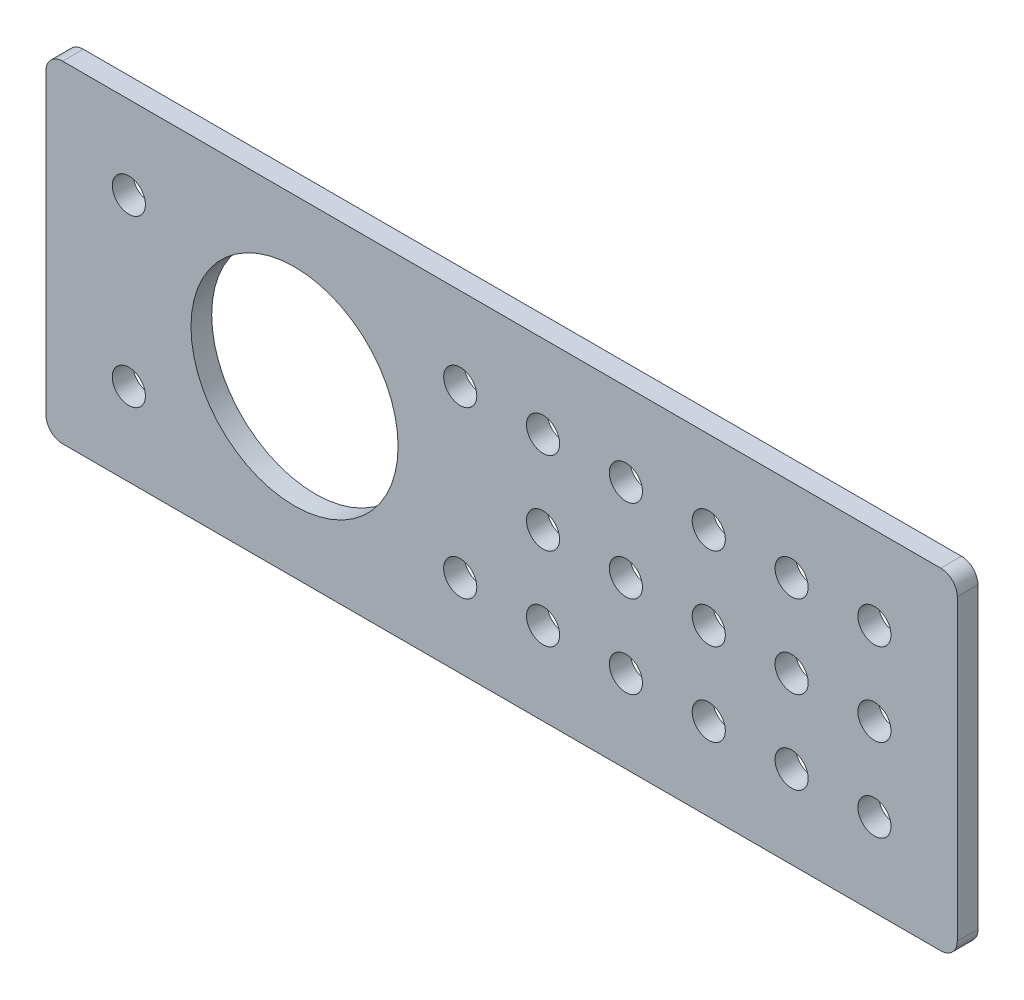
ISO-10303-21;
HEADER;
FILE_DESCRIPTION(('STEP AP214'),'2;1');
FILE_NAME('part.step','',(''),(''),'','','');
FILE_SCHEMA(('AUTOMOTIVE_DESIGN { 1 0 10303 214 1 1 1 1 }'));
ENDSEC;
DATA;
#1=APPLICATION_CONTEXT('core data for automotive mechanical design processes');
#2=APPLICATION_PROTOCOL_DEFINITION('international standard','automotive_design',2000,#1);
#3=PRODUCT_CONTEXT('',#1,'mechanical');
#4=PRODUCT('Part','Part','',(#3));
#5=PRODUCT_RELATED_PRODUCT_CATEGORY('part','',(#4));
#6=PRODUCT_DEFINITION_FORMATION('','',#4);
#7=PRODUCT_DEFINITION_CONTEXT('part definition',#1,'design');
#8=PRODUCT_DEFINITION('design','',#6,#7);
#9=PRODUCT_DEFINITION_SHAPE('','',#8);
#10=(LENGTH_UNIT() NAMED_UNIT(*) SI_UNIT(.MILLI.,.METRE.));
#11=(NAMED_UNIT(*) PLANE_ANGLE_UNIT() SI_UNIT($,.RADIAN.));
#12=(NAMED_UNIT(*) SI_UNIT($,.STERADIAN.) SOLID_ANGLE_UNIT());
#13=UNCERTAINTY_MEASURE_WITH_UNIT(LENGTH_MEASURE(1.E-05),#10,'distance_accuracy_value','');
#14=(GEOMETRIC_REPRESENTATION_CONTEXT(3) GLOBAL_UNCERTAINTY_ASSIGNED_CONTEXT((#13)) GLOBAL_UNIT_ASSIGNED_CONTEXT((#10,
#11,#12)) REPRESENTATION_CONTEXT('',''));
#15=CARTESIAN_POINT('',(0.,0.,0.));
#16=DIRECTION('',(0.,0.,1.));
#17=DIRECTION('',(1.,0.,0.));
#18=AXIS2_PLACEMENT_3D('',#15,#16,#17);
#19=CARTESIAN_POINT('',(0.,0.,3.175));
#20=DIRECTION('',(0.,0.,-1.));
#21=DIRECTION('',(-1.,0.,0.));
#22=AXIS2_PLACEMENT_3D('',#19,#20,#21);
#23=PLANE('',#22);
#24=DIRECTION('',(0.,1.,0.));
#25=VECTOR('',#24,1.);
#26=CARTESIAN_POINT('',(-368.3,25.4,3.175));
#27=LINE('',#26,#25);
#28=CARTESIAN_POINT('',(-368.3,-22.86,3.175));
#29=VERTEX_POINT('',#28);
#30=CARTESIAN_POINT('',(-368.3,22.86,3.175));
#31=VERTEX_POINT('',#30);
#32=EDGE_CURVE('E171',#29,#31,#27,.T.);
#33=ORIENTED_EDGE('',*,*,#32,.T.);
#34=CARTESIAN_POINT('',(-370.84,22.86,3.175));
#35=DIRECTION('',(0.,0.,-1.));
#36=DIRECTION('',(-1.,0.,0.));
#37=AXIS2_PLACEMENT_3D('',#34,#35,#36);
#38=CIRCLE('',#37,2.54);
#39=CARTESIAN_POINT('',(-370.84,25.4,3.175));
#40=VERTEX_POINT('',#39);
#41=EDGE_CURVE('E148',#31,#40,#38,.F.);
#42=ORIENTED_EDGE('',*,*,#41,.T.);
#43=DIRECTION('',(-1.,0.,0.));
#44=VECTOR('',#43,1.);
#45=CARTESIAN_POINT('',(-431.8,25.4,3.175));
#46=LINE('',#45,#44);
#47=CARTESIAN_POINT('',(-505.46,25.4,3.175));
#48=VERTEX_POINT('',#47);
#49=EDGE_CURVE('E119',#40,#48,#46,.T.);
#50=ORIENTED_EDGE('',*,*,#49,.T.);
#51=CARTESIAN_POINT('',(-505.46,22.86,3.175));
#52=DIRECTION('',(0.,0.,-1.));
#53=DIRECTION('',(-1.,0.,0.));
#54=AXIS2_PLACEMENT_3D('',#51,#52,#53);
#55=CIRCLE('',#54,2.54);
#56=CARTESIAN_POINT('',(-508.,22.86,3.175));
#57=VERTEX_POINT('',#56);
#58=EDGE_CURVE('E143',#48,#57,#55,.F.);
#59=ORIENTED_EDGE('',*,*,#58,.T.);
#60=DIRECTION('',(0.,-1.,0.));
#61=VECTOR('',#60,1.);
#62=CARTESIAN_POINT('',(-508.,25.4,3.175));
#63=LINE('',#62,#61);
#64=CARTESIAN_POINT('',(-508.,-22.86,3.175));
#65=VERTEX_POINT('',#64);
#66=EDGE_CURVE('E126',#57,#65,#63,.T.);
#67=ORIENTED_EDGE('',*,*,#66,.T.);
#68=CARTESIAN_POINT('',(-505.46,-22.86,3.175));
#69=DIRECTION('',(0.,0.,-1.));
#70=DIRECTION('',(-1.,0.,0.));
#71=AXIS2_PLACEMENT_3D('',#68,#69,#70);
#72=CIRCLE('',#71,2.54);
#73=CARTESIAN_POINT('',(-505.46,-25.4,3.175));
#74=VERTEX_POINT('',#73);
#75=EDGE_CURVE('E55',#65,#74,#72,.F.);
#76=ORIENTED_EDGE('',*,*,#75,.T.);
#77=DIRECTION('',(1.,0.,0.));
#78=VECTOR('',#77,1.);
#79=CARTESIAN_POINT('',(-481.624580264317,-25.4,3.175));
#80=LINE('',#79,#78);
#81=CARTESIAN_POINT('',(-370.84,-25.4,3.175));
#82=VERTEX_POINT('',#81);
#83=EDGE_CURVE('E129',#74,#82,#80,.T.);
#84=ORIENTED_EDGE('',*,*,#83,.T.);
#85=CARTESIAN_POINT('',(-370.84,-22.86,3.175));
#86=DIRECTION('',(0.,0.,-1.));
#87=DIRECTION('',(-1.,0.,0.));
#88=AXIS2_PLACEMENT_3D('',#85,#86,#87);
#89=CIRCLE('',#88,2.54);
#90=EDGE_CURVE('E146',#82,#29,#89,.F.);
#91=ORIENTED_EDGE('',*,*,#90,.T.);
#92=EDGE_LOOP('',(#33,#42,#50,#59,#67,#76,#84,#91));
#93=FACE_BOUND('',#92,.T.);
#94=CARTESIAN_POINT('',(-469.9,0.,3.175));
#95=DIRECTION('',(0.,0.,1.));
#96=DIRECTION('',(1.,0.,0.));
#97=AXIS2_PLACEMENT_3D('',#94,#95,#96);
#98=CIRCLE('',#97,15.875);
#99=CARTESIAN_POINT('',(-454.025,0.,3.175));
#100=VERTEX_POINT('',#99);
#101=EDGE_CURVE('E164',#100,#100,#98,.T.);
#102=ORIENTED_EDGE('',*,*,#101,.F.);
#103=EDGE_LOOP('',(#102));
#104=FACE_BOUND('',#103,.T.);
#105=CARTESIAN_POINT('',(-495.3,12.7,3.175));
#106=DIRECTION('',(0.,0.,1.));
#107=DIRECTION('',(1.,0.,0.));
#108=AXIS2_PLACEMENT_3D('',#105,#106,#107);
#109=CIRCLE('',#108,2.54000000000001);
#110=CARTESIAN_POINT('',(-492.76,12.7,3.175));
#111=VERTEX_POINT('',#110);
#112=EDGE_CURVE('E176',#111,#111,#109,.T.);
#113=ORIENTED_EDGE('',*,*,#112,.F.);
#114=EDGE_LOOP('',(#113));
#115=FACE_BOUND('',#114,.T.);
#116=CARTESIAN_POINT('',(-495.3,-12.7,3.175));
#117=DIRECTION('',(0.,0.,1.));
#118=DIRECTION('',(1.,0.,0.));
#119=AXIS2_PLACEMENT_3D('',#116,#117,#118);
#120=CIRCLE('',#119,2.54000000000001);
#121=CARTESIAN_POINT('',(-492.76,-12.7,3.175));
#122=VERTEX_POINT('',#121);
#123=EDGE_CURVE('E181',#122,#122,#120,.T.);
#124=ORIENTED_EDGE('',*,*,#123,.F.);
#125=EDGE_LOOP('',(#124));
#126=FACE_BOUND('',#125,.T.);
#127=CARTESIAN_POINT('',(-444.5,-12.7,3.175));
#128=DIRECTION('',(0.,0.,1.));
#129=DIRECTION('',(1.,0.,0.));
#130=AXIS2_PLACEMENT_3D('',#127,#128,#129);
#131=CIRCLE('',#130,2.54000000000001);
#132=CARTESIAN_POINT('',(-441.96,-12.7,3.175));
#133=VERTEX_POINT('',#132);
#134=EDGE_CURVE('E187',#133,#133,#131,.T.);
#135=ORIENTED_EDGE('',*,*,#134,.F.);
#136=EDGE_LOOP('',(#135));
#137=FACE_BOUND('',#136,.T.);
#138=CARTESIAN_POINT('',(-431.8,-12.7,3.175));
#139=DIRECTION('',(0.,0.,1.));
#140=DIRECTION('',(1.,0.,0.));
#141=AXIS2_PLACEMENT_3D('',#138,#139,#140);
#142=CIRCLE('',#141,2.54000000000001);
#143=CARTESIAN_POINT('',(-429.26,-12.7,3.175));
#144=VERTEX_POINT('',#143);
#145=EDGE_CURVE('E193',#144,#144,#142,.T.);
#146=ORIENTED_EDGE('',*,*,#145,.F.);
#147=EDGE_LOOP('',(#146));
#148=FACE_BOUND('',#147,.T.);
#149=CARTESIAN_POINT('',(-419.1,-12.7,3.175));
#150=DIRECTION('',(0.,0.,1.));
#151=DIRECTION('',(1.,0.,0.));
#152=AXIS2_PLACEMENT_3D('',#149,#150,#151);
#153=CIRCLE('',#152,2.54000000000001);
#154=CARTESIAN_POINT('',(-416.56,-12.7,3.175));
#155=VERTEX_POINT('',#154);
#156=EDGE_CURVE('E199',#155,#155,#153,.T.);
#157=ORIENTED_EDGE('',*,*,#156,.F.);
#158=EDGE_LOOP('',(#157));
#159=FACE_BOUND('',#158,.T.);
#160=CARTESIAN_POINT('',(-419.1,0.,3.175));
#161=DIRECTION('',(0.,0.,1.));
#162=DIRECTION('',(1.,0.,0.));
#163=AXIS2_PLACEMENT_3D('',#160,#161,#162);
#164=CIRCLE('',#163,2.54000000000001);
#165=CARTESIAN_POINT('',(-416.56,0.,3.175));
#166=VERTEX_POINT('',#165);
#167=EDGE_CURVE('E205',#166,#166,#164,.T.);
#168=ORIENTED_EDGE('',*,*,#167,.F.);
#169=EDGE_LOOP('',(#168));
#170=FACE_BOUND('',#169,.T.);
#171=CARTESIAN_POINT('',(-431.8,0.,3.175));
#172=DIRECTION('',(0.,0.,1.));
#173=DIRECTION('',(1.,0.,0.));
#174=AXIS2_PLACEMENT_3D('',#171,#172,#173);
#175=CIRCLE('',#174,2.54000000000001);
#176=CARTESIAN_POINT('',(-429.26,0.,3.175));
#177=VERTEX_POINT('',#176);
#178=EDGE_CURVE('E211',#177,#177,#175,.T.);
#179=ORIENTED_EDGE('',*,*,#178,.F.);
#180=EDGE_LOOP('',(#179));
#181=FACE_BOUND('',#180,.T.);
#182=CARTESIAN_POINT('',(-431.8,12.7,3.175));
#183=DIRECTION('',(0.,0.,1.));
#184=DIRECTION('',(1.,0.,0.));
#185=AXIS2_PLACEMENT_3D('',#182,#183,#184);
#186=CIRCLE('',#185,2.54000000000001);
#187=CARTESIAN_POINT('',(-429.26,12.7,3.175));
#188=VERTEX_POINT('',#187);
#189=EDGE_CURVE('E217',#188,#188,#186,.T.);
#190=ORIENTED_EDGE('',*,*,#189,.F.);
#191=EDGE_LOOP('',(#190));
#192=FACE_BOUND('',#191,.T.);
#193=CARTESIAN_POINT('',(-419.1,12.7,3.175));
#194=DIRECTION('',(0.,0.,1.));
#195=DIRECTION('',(1.,0.,0.));
#196=AXIS2_PLACEMENT_3D('',#193,#194,#195);
#197=CIRCLE('',#196,2.54000000000001);
#198=CARTESIAN_POINT('',(-416.56,12.7,3.175));
#199=VERTEX_POINT('',#198);
#200=EDGE_CURVE('E223',#199,#199,#197,.T.);
#201=ORIENTED_EDGE('',*,*,#200,.F.);
#202=EDGE_LOOP('',(#201));
#203=FACE_BOUND('',#202,.T.);
#204=CARTESIAN_POINT('',(-444.5,12.7,3.175));
#205=DIRECTION('',(0.,0.,1.));
#206=DIRECTION('',(1.,0.,0.));
#207=AXIS2_PLACEMENT_3D('',#204,#205,#206);
#208=CIRCLE('',#207,2.54000000000001);
#209=CARTESIAN_POINT('',(-441.96,12.7,3.175));
#210=VERTEX_POINT('',#209);
#211=EDGE_CURVE('E229',#210,#210,#208,.T.);
#212=ORIENTED_EDGE('',*,*,#211,.F.);
#213=EDGE_LOOP('',(#212));
#214=FACE_BOUND('',#213,.T.);
#215=CARTESIAN_POINT('',(-406.4,-12.7,3.175));
#216=DIRECTION('',(0.,0.,1.));
#217=DIRECTION('',(1.,0.,0.));
#218=AXIS2_PLACEMENT_3D('',#215,#216,#217);
#219=CIRCLE('',#218,2.54000000000001);
#220=CARTESIAN_POINT('',(-403.86,-12.7,3.175));
#221=VERTEX_POINT('',#220);
#222=EDGE_CURVE('E235',#221,#221,#219,.T.);
#223=ORIENTED_EDGE('',*,*,#222,.F.);
#224=EDGE_LOOP('',(#223));
#225=FACE_BOUND('',#224,.T.);
#226=CARTESIAN_POINT('',(-406.4,0.,3.175));
#227=DIRECTION('',(0.,0.,1.));
#228=DIRECTION('',(1.,0.,0.));
#229=AXIS2_PLACEMENT_3D('',#226,#227,#228);
#230=CIRCLE('',#229,2.54000000000001);
#231=CARTESIAN_POINT('',(-403.86,0.,3.175));
#232=VERTEX_POINT('',#231);
#233=EDGE_CURVE('E241',#232,#232,#230,.T.);
#234=ORIENTED_EDGE('',*,*,#233,.F.);
#235=EDGE_LOOP('',(#234));
#236=FACE_BOUND('',#235,.T.);
#237=CARTESIAN_POINT('',(-406.4,12.7,3.175));
#238=DIRECTION('',(0.,0.,1.));
#239=DIRECTION('',(1.,0.,0.));
#240=AXIS2_PLACEMENT_3D('',#237,#238,#239);
#241=CIRCLE('',#240,2.54000000000001);
#242=CARTESIAN_POINT('',(-403.86,12.7,3.175));
#243=VERTEX_POINT('',#242);
#244=EDGE_CURVE('E247',#243,#243,#241,.T.);
#245=ORIENTED_EDGE('',*,*,#244,.F.);
#246=EDGE_LOOP('',(#245));
#247=FACE_BOUND('',#246,.T.);
#248=CARTESIAN_POINT('',(-393.7,-12.7,3.175));
#249=DIRECTION('',(0.,0.,1.));
#250=DIRECTION('',(1.,0.,0.));
#251=AXIS2_PLACEMENT_3D('',#248,#249,#250);
#252=CIRCLE('',#251,2.54000000000001);
#253=CARTESIAN_POINT('',(-391.16,-12.7,3.175));
#254=VERTEX_POINT('',#253);
#255=EDGE_CURVE('E253',#254,#254,#252,.T.);
#256=ORIENTED_EDGE('',*,*,#255,.F.);
#257=EDGE_LOOP('',(#256));
#258=FACE_BOUND('',#257,.T.);
#259=CARTESIAN_POINT('',(-393.7,0.,3.175));
#260=DIRECTION('',(0.,0.,1.));
#261=DIRECTION('',(1.,0.,0.));
#262=AXIS2_PLACEMENT_3D('',#259,#260,#261);
#263=CIRCLE('',#262,2.54000000000001);
#264=CARTESIAN_POINT('',(-391.16,0.,3.175));
#265=VERTEX_POINT('',#264);
#266=EDGE_CURVE('E259',#265,#265,#263,.T.);
#267=ORIENTED_EDGE('',*,*,#266,.F.);
#268=EDGE_LOOP('',(#267));
#269=FACE_BOUND('',#268,.T.);
#270=CARTESIAN_POINT('',(-393.7,12.7,3.175));
#271=DIRECTION('',(0.,0.,1.));
#272=DIRECTION('',(1.,0.,0.));
#273=AXIS2_PLACEMENT_3D('',#270,#271,#272);
#274=CIRCLE('',#273,2.54000000000001);
#275=CARTESIAN_POINT('',(-391.16,12.7,3.175));
#276=VERTEX_POINT('',#275);
#277=EDGE_CURVE('E265',#276,#276,#274,.T.);
#278=ORIENTED_EDGE('',*,*,#277,.F.);
#279=EDGE_LOOP('',(#278));
#280=FACE_BOUND('',#279,.T.);
#281=CARTESIAN_POINT('',(-381.,-12.7,3.175));
#282=DIRECTION('',(0.,0.,1.));
#283=DIRECTION('',(1.,0.,0.));
#284=AXIS2_PLACEMENT_3D('',#281,#282,#283);
#285=CIRCLE('',#284,2.54000000000006);
#286=CARTESIAN_POINT('',(-378.46,-12.7,3.175));
#287=VERTEX_POINT('',#286);
#288=EDGE_CURVE('E271',#287,#287,#285,.T.);
#289=ORIENTED_EDGE('',*,*,#288,.F.);
#290=EDGE_LOOP('',(#289));
#291=FACE_BOUND('',#290,.T.);
#292=CARTESIAN_POINT('',(-381.,0.,3.175));
#293=DIRECTION('',(0.,0.,1.));
#294=DIRECTION('',(1.,0.,0.));
#295=AXIS2_PLACEMENT_3D('',#292,#293,#294);
#296=CIRCLE('',#295,2.54000000000006);
#297=CARTESIAN_POINT('',(-378.46,0.,3.175));
#298=VERTEX_POINT('',#297);
#299=EDGE_CURVE('E277',#298,#298,#296,.T.);
#300=ORIENTED_EDGE('',*,*,#299,.F.);
#301=EDGE_LOOP('',(#300));
#302=FACE_BOUND('',#301,.T.);
#303=CARTESIAN_POINT('',(-381.,12.7,3.175));
#304=DIRECTION('',(0.,0.,1.));
#305=DIRECTION('',(1.,0.,0.));
#306=AXIS2_PLACEMENT_3D('',#303,#304,#305);
#307=CIRCLE('',#306,2.54000000000006);
#308=CARTESIAN_POINT('',(-378.46,12.7,3.175));
#309=VERTEX_POINT('',#308);
#310=EDGE_CURVE('E283',#309,#309,#307,.T.);
#311=ORIENTED_EDGE('',*,*,#310,.F.);
#312=EDGE_LOOP('',(#311));
#313=FACE_BOUND('',#312,.T.);
#314=ADVANCED_FACE('F33',(#93,#104,#115,#126,#137,#148,#159,#170,#181,#192,#203,#214,#225,#236,
#247,#258,#269,#280,#291,#302,#313),#23,.F.);
#315=CARTESIAN_POINT('',(0.,0.,0.));
#316=DIRECTION('',(0.,0.,-1.));
#317=DIRECTION('',(-1.,0.,0.));
#318=AXIS2_PLACEMENT_3D('',#315,#316,#317);
#319=PLANE('',#318);
#320=CARTESIAN_POINT('',(-381.,0.,0.));
#321=DIRECTION('',(0.,0.,1.));
#322=DIRECTION('',(1.,0.,0.));
#323=AXIS2_PLACEMENT_3D('',#320,#321,#322);
#324=CIRCLE('',#323,2.54000000000006);
#325=CARTESIAN_POINT('',(-378.46,0.,0.));
#326=VERTEX_POINT('',#325);
#327=EDGE_CURVE('E280',#326,#326,#324,.T.);
#328=ORIENTED_EDGE('',*,*,#327,.T.);
#329=EDGE_LOOP('',(#328));
#330=FACE_BOUND('',#329,.T.);
#331=CARTESIAN_POINT('',(-393.7,12.7,0.));
#332=DIRECTION('',(0.,0.,1.));
#333=DIRECTION('',(1.,0.,0.));
#334=AXIS2_PLACEMENT_3D('',#331,#332,#333);
#335=CIRCLE('',#334,2.54000000000001);
#336=CARTESIAN_POINT('',(-391.16,12.7,0.));
#337=VERTEX_POINT('',#336);
#338=EDGE_CURVE('E268',#337,#337,#335,.T.);
#339=ORIENTED_EDGE('',*,*,#338,.T.);
#340=EDGE_LOOP('',(#339));
#341=FACE_BOUND('',#340,.T.);
#342=CARTESIAN_POINT('',(-393.7,-12.7,0.));
#343=DIRECTION('',(0.,0.,1.));
#344=DIRECTION('',(1.,0.,0.));
#345=AXIS2_PLACEMENT_3D('',#342,#343,#344);
#346=CIRCLE('',#345,2.54000000000001);
#347=CARTESIAN_POINT('',(-391.16,-12.7,0.));
#348=VERTEX_POINT('',#347);
#349=EDGE_CURVE('E256',#348,#348,#346,.T.);
#350=ORIENTED_EDGE('',*,*,#349,.T.);
#351=EDGE_LOOP('',(#350));
#352=FACE_BOUND('',#351,.T.);
#353=CARTESIAN_POINT('',(-406.4,0.,0.));
#354=DIRECTION('',(0.,0.,1.));
#355=DIRECTION('',(1.,0.,0.));
#356=AXIS2_PLACEMENT_3D('',#353,#354,#355);
#357=CIRCLE('',#356,2.54000000000001);
#358=CARTESIAN_POINT('',(-403.86,0.,0.));
#359=VERTEX_POINT('',#358);
#360=EDGE_CURVE('E244',#359,#359,#357,.T.);
#361=ORIENTED_EDGE('',*,*,#360,.T.);
#362=EDGE_LOOP('',(#361));
#363=FACE_BOUND('',#362,.T.);
#364=CARTESIAN_POINT('',(-444.5,12.7,0.));
#365=DIRECTION('',(0.,0.,1.));
#366=DIRECTION('',(1.,0.,0.));
#367=AXIS2_PLACEMENT_3D('',#364,#365,#366);
#368=CIRCLE('',#367,2.54000000000001);
#369=CARTESIAN_POINT('',(-441.96,12.7,0.));
#370=VERTEX_POINT('',#369);
#371=EDGE_CURVE('E232',#370,#370,#368,.T.);
#372=ORIENTED_EDGE('',*,*,#371,.T.);
#373=EDGE_LOOP('',(#372));
#374=FACE_BOUND('',#373,.T.);
#375=CARTESIAN_POINT('',(-431.8,12.7,0.));
#376=DIRECTION('',(0.,0.,1.));
#377=DIRECTION('',(1.,0.,0.));
#378=AXIS2_PLACEMENT_3D('',#375,#376,#377);
#379=CIRCLE('',#378,2.54000000000001);
#380=CARTESIAN_POINT('',(-429.26,12.7,0.));
#381=VERTEX_POINT('',#380);
#382=EDGE_CURVE('E220',#381,#381,#379,.T.);
#383=ORIENTED_EDGE('',*,*,#382,.T.);
#384=EDGE_LOOP('',(#383));
#385=FACE_BOUND('',#384,.T.);
#386=CARTESIAN_POINT('',(-419.1,0.,0.));
#387=DIRECTION('',(0.,0.,1.));
#388=DIRECTION('',(1.,0.,0.));
#389=AXIS2_PLACEMENT_3D('',#386,#387,#388);
#390=CIRCLE('',#389,2.54000000000001);
#391=CARTESIAN_POINT('',(-416.56,0.,0.));
#392=VERTEX_POINT('',#391);
#393=EDGE_CURVE('E208',#392,#392,#390,.T.);
#394=ORIENTED_EDGE('',*,*,#393,.T.);
#395=EDGE_LOOP('',(#394));
#396=FACE_BOUND('',#395,.T.);
#397=CARTESIAN_POINT('',(-431.8,-12.7,0.));
#398=DIRECTION('',(0.,0.,1.));
#399=DIRECTION('',(1.,0.,0.));
#400=AXIS2_PLACEMENT_3D('',#397,#398,#399);
#401=CIRCLE('',#400,2.54000000000001);
#402=CARTESIAN_POINT('',(-429.26,-12.7,0.));
#403=VERTEX_POINT('',#402);
#404=EDGE_CURVE('E196',#403,#403,#401,.T.);
#405=ORIENTED_EDGE('',*,*,#404,.T.);
#406=EDGE_LOOP('',(#405));
#407=FACE_BOUND('',#406,.T.);
#408=CARTESIAN_POINT('',(-495.3,-12.7,0.));
#409=DIRECTION('',(0.,0.,1.));
#410=DIRECTION('',(1.,0.,0.));
#411=AXIS2_PLACEMENT_3D('',#408,#409,#410);
#412=CIRCLE('',#411,2.54000000000001);
#413=CARTESIAN_POINT('',(-492.76,-12.7,0.));
#414=VERTEX_POINT('',#413);
#415=EDGE_CURVE('E184',#414,#414,#412,.T.);
#416=ORIENTED_EDGE('',*,*,#415,.T.);
#417=EDGE_LOOP('',(#416));
#418=FACE_BOUND('',#417,.T.);
#419=CARTESIAN_POINT('',(-469.9,0.,0.));
#420=DIRECTION('',(0.,0.,1.));
#421=DIRECTION('',(1.,0.,0.));
#422=AXIS2_PLACEMENT_3D('',#419,#420,#421);
#423=CIRCLE('',#422,15.875);
#424=CARTESIAN_POINT('',(-454.025,0.,0.));
#425=VERTEX_POINT('',#424);
#426=EDGE_CURVE('E167',#425,#425,#423,.T.);
#427=ORIENTED_EDGE('',*,*,#426,.T.);
#428=EDGE_LOOP('',(#427));
#429=FACE_BOUND('',#428,.T.);
#430=DIRECTION('',(-1.,0.,0.));
#431=VECTOR('',#430,1.);
#432=CARTESIAN_POINT('',(-508.,25.4,0.));
#433=LINE('',#432,#431);
#434=CARTESIAN_POINT('',(-370.84,25.4,0.));
#435=VERTEX_POINT('',#434);
#436=CARTESIAN_POINT('',(-505.46,25.4,0.));
#437=VERTEX_POINT('',#436);
#438=EDGE_CURVE('E116',#435,#437,#433,.T.);
#439=ORIENTED_EDGE('',*,*,#438,.F.);
#440=CARTESIAN_POINT('',(-370.84,22.86,0.));
#441=DIRECTION('',(0.,0.,-1.));
#442=DIRECTION('',(-1.,0.,0.));
#443=AXIS2_PLACEMENT_3D('',#440,#441,#442);
#444=CIRCLE('',#443,2.54);
#445=CARTESIAN_POINT('',(-368.3,22.86,0.));
#446=VERTEX_POINT('',#445);
#447=EDGE_CURVE('E99',#435,#446,#444,.T.);
#448=ORIENTED_EDGE('',*,*,#447,.T.);
#449=DIRECTION('',(0.,1.,0.));
#450=VECTOR('',#449,1.);
#451=CARTESIAN_POINT('',(-368.3,25.4,0.));
#452=LINE('',#451,#450);
#453=CARTESIAN_POINT('',(-368.3,-22.86,0.));
#454=VERTEX_POINT('',#453);
#455=EDGE_CURVE('E127',#454,#446,#452,.T.);
#456=ORIENTED_EDGE('',*,*,#455,.F.);
#457=CARTESIAN_POINT('',(-370.84,-22.86,0.));
#458=DIRECTION('',(0.,0.,-1.));
#459=DIRECTION('',(-1.,0.,0.));
#460=AXIS2_PLACEMENT_3D('',#457,#458,#459);
#461=CIRCLE('',#460,2.54);
#462=CARTESIAN_POINT('',(-370.84,-25.4,0.));
#463=VERTEX_POINT('',#462);
#464=EDGE_CURVE('E110',#454,#463,#461,.T.);
#465=ORIENTED_EDGE('',*,*,#464,.T.);
#466=DIRECTION('',(1.,0.,0.));
#467=VECTOR('',#466,1.);
#468=CARTESIAN_POINT('',(-368.3,-25.4,0.));
#469=LINE('',#468,#467);
#470=CARTESIAN_POINT('',(-505.46,-25.4,0.));
#471=VERTEX_POINT('',#470);
#472=EDGE_CURVE('E131',#471,#463,#469,.T.);
#473=ORIENTED_EDGE('',*,*,#472,.F.);
#474=CARTESIAN_POINT('',(-505.46,-22.86,0.));
#475=DIRECTION('',(0.,0.,-1.));
#476=DIRECTION('',(-1.,0.,0.));
#477=AXIS2_PLACEMENT_3D('',#474,#475,#476);
#478=CIRCLE('',#477,2.54);
#479=CARTESIAN_POINT('',(-508.,-22.86,0.));
#480=VERTEX_POINT('',#479);
#481=EDGE_CURVE('E137',#471,#480,#478,.T.);
#482=ORIENTED_EDGE('',*,*,#481,.T.);
#483=DIRECTION('',(0.,-1.,0.));
#484=VECTOR('',#483,1.);
#485=CARTESIAN_POINT('',(-508.,25.4,0.));
#486=LINE('',#485,#484);
#487=CARTESIAN_POINT('',(-508.,22.86,0.));
#488=VERTEX_POINT('',#487);
#489=EDGE_CURVE('E159',#488,#480,#486,.T.);
#490=ORIENTED_EDGE('',*,*,#489,.F.);
#491=CARTESIAN_POINT('',(-505.46,22.86,0.));
#492=DIRECTION('',(0.,0.,-1.));
#493=DIRECTION('',(-1.,0.,0.));
#494=AXIS2_PLACEMENT_3D('',#491,#492,#493);
#495=CIRCLE('',#494,2.54);
#496=EDGE_CURVE('E120',#488,#437,#495,.T.);
#497=ORIENTED_EDGE('',*,*,#496,.T.);
#498=EDGE_LOOP('',(#439,#448,#456,#465,#473,#482,#490,#497));
#499=FACE_BOUND('',#498,.T.);
#500=CARTESIAN_POINT('',(-495.3,12.7,0.));
#501=DIRECTION('',(0.,0.,1.));
#502=DIRECTION('',(1.,0.,0.));
#503=AXIS2_PLACEMENT_3D('',#500,#501,#502);
#504=CIRCLE('',#503,2.54000000000001);
#505=CARTESIAN_POINT('',(-492.76,12.7,0.));
#506=VERTEX_POINT('',#505);
#507=EDGE_CURVE('E178',#506,#506,#504,.T.);
#508=ORIENTED_EDGE('',*,*,#507,.T.);
#509=EDGE_LOOP('',(#508));
#510=FACE_BOUND('',#509,.T.);
#511=CARTESIAN_POINT('',(-444.5,-12.7,0.));
#512=DIRECTION('',(0.,0.,1.));
#513=DIRECTION('',(1.,0.,0.));
#514=AXIS2_PLACEMENT_3D('',#511,#512,#513);
#515=CIRCLE('',#514,2.54000000000001);
#516=CARTESIAN_POINT('',(-441.96,-12.7,0.));
#517=VERTEX_POINT('',#516);
#518=EDGE_CURVE('E190',#517,#517,#515,.T.);
#519=ORIENTED_EDGE('',*,*,#518,.T.);
#520=EDGE_LOOP('',(#519));
#521=FACE_BOUND('',#520,.T.);
#522=CARTESIAN_POINT('',(-419.1,-12.7,0.));
#523=DIRECTION('',(0.,0.,1.));
#524=DIRECTION('',(1.,0.,0.));
#525=AXIS2_PLACEMENT_3D('',#522,#523,#524);
#526=CIRCLE('',#525,2.54000000000001);
#527=CARTESIAN_POINT('',(-416.56,-12.7,0.));
#528=VERTEX_POINT('',#527);
#529=EDGE_CURVE('E202',#528,#528,#526,.T.);
#530=ORIENTED_EDGE('',*,*,#529,.T.);
#531=EDGE_LOOP('',(#530));
#532=FACE_BOUND('',#531,.T.);
#533=CARTESIAN_POINT('',(-431.8,0.,0.));
#534=DIRECTION('',(0.,0.,1.));
#535=DIRECTION('',(1.,0.,0.));
#536=AXIS2_PLACEMENT_3D('',#533,#534,#535);
#537=CIRCLE('',#536,2.54000000000001);
#538=CARTESIAN_POINT('',(-429.26,0.,0.));
#539=VERTEX_POINT('',#538);
#540=EDGE_CURVE('E214',#539,#539,#537,.T.);
#541=ORIENTED_EDGE('',*,*,#540,.T.);
#542=EDGE_LOOP('',(#541));
#543=FACE_BOUND('',#542,.T.);
#544=CARTESIAN_POINT('',(-419.1,12.7,0.));
#545=DIRECTION('',(0.,0.,1.));
#546=DIRECTION('',(1.,0.,0.));
#547=AXIS2_PLACEMENT_3D('',#544,#545,#546);
#548=CIRCLE('',#547,2.54000000000001);
#549=CARTESIAN_POINT('',(-416.56,12.7,0.));
#550=VERTEX_POINT('',#549);
#551=EDGE_CURVE('E226',#550,#550,#548,.T.);
#552=ORIENTED_EDGE('',*,*,#551,.T.);
#553=EDGE_LOOP('',(#552));
#554=FACE_BOUND('',#553,.T.);
#555=CARTESIAN_POINT('',(-406.4,-12.7,0.));
#556=DIRECTION('',(0.,0.,1.));
#557=DIRECTION('',(1.,0.,0.));
#558=AXIS2_PLACEMENT_3D('',#555,#556,#557);
#559=CIRCLE('',#558,2.54000000000001);
#560=CARTESIAN_POINT('',(-403.86,-12.7,0.));
#561=VERTEX_POINT('',#560);
#562=EDGE_CURVE('E238',#561,#561,#559,.T.);
#563=ORIENTED_EDGE('',*,*,#562,.T.);
#564=EDGE_LOOP('',(#563));
#565=FACE_BOUND('',#564,.T.);
#566=CARTESIAN_POINT('',(-406.4,12.7,0.));
#567=DIRECTION('',(0.,0.,1.));
#568=DIRECTION('',(1.,0.,0.));
#569=AXIS2_PLACEMENT_3D('',#566,#567,#568);
#570=CIRCLE('',#569,2.54000000000001);
#571=CARTESIAN_POINT('',(-403.86,12.7,0.));
#572=VERTEX_POINT('',#571);
#573=EDGE_CURVE('E250',#572,#572,#570,.T.);
#574=ORIENTED_EDGE('',*,*,#573,.T.);
#575=EDGE_LOOP('',(#574));
#576=FACE_BOUND('',#575,.T.);
#577=CARTESIAN_POINT('',(-393.7,0.,0.));
#578=DIRECTION('',(0.,0.,1.));
#579=DIRECTION('',(1.,0.,0.));
#580=AXIS2_PLACEMENT_3D('',#577,#578,#579);
#581=CIRCLE('',#580,2.54000000000001);
#582=CARTESIAN_POINT('',(-391.16,0.,0.));
#583=VERTEX_POINT('',#582);
#584=EDGE_CURVE('E262',#583,#583,#581,.T.);
#585=ORIENTED_EDGE('',*,*,#584,.T.);
#586=EDGE_LOOP('',(#585));
#587=FACE_BOUND('',#586,.T.);
#588=CARTESIAN_POINT('',(-381.,-12.7,0.));
#589=DIRECTION('',(0.,0.,1.));
#590=DIRECTION('',(1.,0.,0.));
#591=AXIS2_PLACEMENT_3D('',#588,#589,#590);
#592=CIRCLE('',#591,2.54000000000006);
#593=CARTESIAN_POINT('',(-378.46,-12.7,0.));
#594=VERTEX_POINT('',#593);
#595=EDGE_CURVE('E274',#594,#594,#592,.T.);
#596=ORIENTED_EDGE('',*,*,#595,.T.);
#597=EDGE_LOOP('',(#596));
#598=FACE_BOUND('',#597,.T.);
#599=CARTESIAN_POINT('',(-381.,12.7,0.));
#600=DIRECTION('',(0.,0.,1.));
#601=DIRECTION('',(1.,0.,0.));
#602=AXIS2_PLACEMENT_3D('',#599,#600,#601);
#603=CIRCLE('',#602,2.54000000000006);
#604=CARTESIAN_POINT('',(-378.46,12.7,0.));
#605=VERTEX_POINT('',#604);
#606=EDGE_CURVE('E286',#605,#605,#603,.T.);
#607=ORIENTED_EDGE('',*,*,#606,.T.);
#608=EDGE_LOOP('',(#607));
#609=FACE_BOUND('',#608,.T.);
#610=ADVANCED_FACE('F123',(#330,#341,#352,#363,#374,#385,#396,#407,#418,#429,#499,#510,#521,
#532,#543,#554,#565,#576,#587,#598,#609),#319,.T.);
#611=CARTESIAN_POINT('',(-508.,25.4,3.175));
#612=DIRECTION('',(1.,0.,0.));
#613=DIRECTION('',(0.,0.,-1.));
#614=AXIS2_PLACEMENT_3D('',#611,#612,#613);
#615=PLANE('',#614);
#616=ORIENTED_EDGE('',*,*,#489,.T.);
#617=DIRECTION('',(0.,0.,-1.));
#618=VECTOR('',#617,1.);
#619=CARTESIAN_POINT('',(-508.,-22.86,3.175));
#620=LINE('',#619,#618);
#621=EDGE_CURVE('E11',#480,#65,#620,.F.);
#622=ORIENTED_EDGE('',*,*,#621,.T.);
#623=ORIENTED_EDGE('',*,*,#66,.F.);
#624=DIRECTION('',(0.,0.,-1.));
#625=VECTOR('',#624,1.);
#626=CARTESIAN_POINT('',(-508.,22.86,3.175));
#627=LINE('',#626,#625);
#628=EDGE_CURVE('E41',#57,#488,#627,.T.);
#629=ORIENTED_EDGE('',*,*,#628,.T.);
#630=EDGE_LOOP('',(#616,#622,#623,#629));
#631=FACE_BOUND('',#630,.T.);
#632=ADVANCED_FACE('F158',(#631),#615,.F.);
#633=CARTESIAN_POINT('',(-368.3,-25.4,3.175));
#634=DIRECTION('',(0.,1.,0.));
#635=DIRECTION('',(-1.,0.,0.));
#636=AXIS2_PLACEMENT_3D('',#633,#634,#635);
#637=PLANE('',#636);
#638=ORIENTED_EDGE('',*,*,#472,.T.);
#639=DIRECTION('',(0.,0.,-1.));
#640=VECTOR('',#639,1.);
#641=CARTESIAN_POINT('',(-370.84,-25.4,3.175));
#642=LINE('',#641,#640);
#643=EDGE_CURVE('E48',#463,#82,#642,.F.);
#644=ORIENTED_EDGE('',*,*,#643,.T.);
#645=ORIENTED_EDGE('',*,*,#83,.F.);
#646=DIRECTION('',(0.,0.,-1.));
#647=VECTOR('',#646,1.);
#648=CARTESIAN_POINT('',(-505.46,-25.4,3.175));
#649=LINE('',#648,#647);
#650=EDGE_CURVE('E150',#74,#471,#649,.T.);
#651=ORIENTED_EDGE('',*,*,#650,.T.);
#652=EDGE_LOOP('',(#638,#644,#645,#651));
#653=FACE_BOUND('',#652,.T.);
#654=ADVANCED_FACE('F312',(#653),#637,.F.);
#655=CARTESIAN_POINT('',(-368.3,25.4,3.175));
#656=DIRECTION('',(-1.,0.,0.));
#657=DIRECTION('',(0.,0.,1.));
#658=AXIS2_PLACEMENT_3D('',#655,#656,#657);
#659=PLANE('',#658);
#660=ORIENTED_EDGE('',*,*,#455,.T.);
#661=DIRECTION('',(0.,0.,-1.));
#662=VECTOR('',#661,1.);
#663=CARTESIAN_POINT('',(-368.3,22.86,3.175));
#664=LINE('',#663,#662);
#665=EDGE_CURVE('E104',#446,#31,#664,.F.);
#666=ORIENTED_EDGE('',*,*,#665,.T.);
#667=ORIENTED_EDGE('',*,*,#32,.F.);
#668=DIRECTION('',(0.,0.,-1.));
#669=VECTOR('',#668,1.);
#670=CARTESIAN_POINT('',(-368.3,-22.86,3.175));
#671=LINE('',#670,#669);
#672=EDGE_CURVE('E109',#29,#454,#671,.T.);
#673=ORIENTED_EDGE('',*,*,#672,.T.);
#674=EDGE_LOOP('',(#660,#666,#667,#673));
#675=FACE_BOUND('',#674,.T.);
#676=ADVANCED_FACE('F309',(#675),#659,.F.);
#677=CARTESIAN_POINT('',(-508.,25.4,3.175));
#678=DIRECTION('',(0.,-1.,0.));
#679=DIRECTION('',(0.,0.,-1.));
#680=AXIS2_PLACEMENT_3D('',#677,#678,#679);
#681=PLANE('',#680);
#682=ORIENTED_EDGE('',*,*,#49,.F.);
#683=DIRECTION('',(0.,0.,-1.));
#684=VECTOR('',#683,1.);
#685=CARTESIAN_POINT('',(-370.84,25.4,3.175));
#686=LINE('',#685,#684);
#687=EDGE_CURVE('E103',#40,#435,#686,.T.);
#688=ORIENTED_EDGE('',*,*,#687,.T.);
#689=ORIENTED_EDGE('',*,*,#438,.T.);
#690=DIRECTION('',(0.,0.,-1.));
#691=VECTOR('',#690,1.);
#692=CARTESIAN_POINT('',(-505.46,25.4,3.175));
#693=LINE('',#692,#691);
#694=EDGE_CURVE('E121',#437,#48,#693,.F.);
#695=ORIENTED_EDGE('',*,*,#694,.T.);
#696=EDGE_LOOP('',(#682,#688,#689,#695));
#697=FACE_BOUND('',#696,.T.);
#698=ADVANCED_FACE('F115',(#697),#681,.F.);
#699=CARTESIAN_POINT('',(-469.9,0.,3.175));
#700=DIRECTION('',(0.,0.,-1.));
#701=DIRECTION('',(-1.,0.,0.));
#702=AXIS2_PLACEMENT_3D('',#699,#700,#701);
#703=CYLINDRICAL_SURFACE('',#702,15.875);
#704=ORIENTED_EDGE('',*,*,#101,.T.);
#705=EDGE_LOOP('',(#704));
#706=FACE_BOUND('',#705,.T.);
#707=ORIENTED_EDGE('',*,*,#426,.F.);
#708=EDGE_LOOP('',(#707));
#709=FACE_BOUND('',#708,.T.);
#710=ADVANCED_FACE('F304',(#706,#709),#703,.F.);
#711=CARTESIAN_POINT('',(-495.3,12.7,3.175));
#712=DIRECTION('',(0.,0.,-1.));
#713=DIRECTION('',(-1.,0.,0.));
#714=AXIS2_PLACEMENT_3D('',#711,#712,#713);
#715=CYLINDRICAL_SURFACE('',#714,2.54000000000001);
#716=ORIENTED_EDGE('',*,*,#112,.T.);
#717=EDGE_LOOP('',(#716));
#718=FACE_BOUND('',#717,.T.);
#719=ORIENTED_EDGE('',*,*,#507,.F.);
#720=EDGE_LOOP('',(#719));
#721=FACE_BOUND('',#720,.T.);
#722=ADVANCED_FACE('F569',(#718,#721),#715,.F.);
#723=CARTESIAN_POINT('',(-495.3,-12.7,3.175));
#724=DIRECTION('',(0.,0.,-1.));
#725=DIRECTION('',(-1.,0.,0.));
#726=AXIS2_PLACEMENT_3D('',#723,#724,#725);
#727=CYLINDRICAL_SURFACE('',#726,2.54000000000001);
#728=ORIENTED_EDGE('',*,*,#123,.T.);
#729=EDGE_LOOP('',(#728));
#730=FACE_BOUND('',#729,.T.);
#731=ORIENTED_EDGE('',*,*,#415,.F.);
#732=EDGE_LOOP('',(#731));
#733=FACE_BOUND('',#732,.T.);
#734=ADVANCED_FACE('F559',(#730,#733),#727,.F.);
#735=CARTESIAN_POINT('',(-444.5,-12.7,3.175));
#736=DIRECTION('',(0.,0.,-1.));
#737=DIRECTION('',(-1.,0.,0.));
#738=AXIS2_PLACEMENT_3D('',#735,#736,#737);
#739=CYLINDRICAL_SURFACE('',#738,2.54000000000001);
#740=ORIENTED_EDGE('',*,*,#134,.T.);
#741=EDGE_LOOP('',(#740));
#742=FACE_BOUND('',#741,.T.);
#743=ORIENTED_EDGE('',*,*,#518,.F.);
#744=EDGE_LOOP('',(#743));
#745=FACE_BOUND('',#744,.T.);
#746=ADVANCED_FACE('F549',(#742,#745),#739,.F.);
#747=CARTESIAN_POINT('',(-431.8,-12.7,3.175));
#748=DIRECTION('',(0.,0.,-1.));
#749=DIRECTION('',(-1.,0.,0.));
#750=AXIS2_PLACEMENT_3D('',#747,#748,#749);
#751=CYLINDRICAL_SURFACE('',#750,2.54000000000001);
#752=ORIENTED_EDGE('',*,*,#145,.T.);
#753=EDGE_LOOP('',(#752));
#754=FACE_BOUND('',#753,.T.);
#755=ORIENTED_EDGE('',*,*,#404,.F.);
#756=EDGE_LOOP('',(#755));
#757=FACE_BOUND('',#756,.T.);
#758=ADVANCED_FACE('F539',(#754,#757),#751,.F.);
#759=CARTESIAN_POINT('',(-419.1,-12.7,3.175));
#760=DIRECTION('',(0.,0.,-1.));
#761=DIRECTION('',(-1.,0.,0.));
#762=AXIS2_PLACEMENT_3D('',#759,#760,#761);
#763=CYLINDRICAL_SURFACE('',#762,2.54000000000001);
#764=ORIENTED_EDGE('',*,*,#156,.T.);
#765=EDGE_LOOP('',(#764));
#766=FACE_BOUND('',#765,.T.);
#767=ORIENTED_EDGE('',*,*,#529,.F.);
#768=EDGE_LOOP('',(#767));
#769=FACE_BOUND('',#768,.T.);
#770=ADVANCED_FACE('F529',(#766,#769),#763,.F.);
#771=CARTESIAN_POINT('',(-419.1,0.,3.175));
#772=DIRECTION('',(0.,0.,-1.));
#773=DIRECTION('',(-1.,0.,0.));
#774=AXIS2_PLACEMENT_3D('',#771,#772,#773);
#775=CYLINDRICAL_SURFACE('',#774,2.54000000000001);
#776=ORIENTED_EDGE('',*,*,#167,.T.);
#777=EDGE_LOOP('',(#776));
#778=FACE_BOUND('',#777,.T.);
#779=ORIENTED_EDGE('',*,*,#393,.F.);
#780=EDGE_LOOP('',(#779));
#781=FACE_BOUND('',#780,.T.);
#782=ADVANCED_FACE('F519',(#778,#781),#775,.F.);
#783=CARTESIAN_POINT('',(-431.8,0.,3.175));
#784=DIRECTION('',(0.,0.,-1.));
#785=DIRECTION('',(-1.,0.,0.));
#786=AXIS2_PLACEMENT_3D('',#783,#784,#785);
#787=CYLINDRICAL_SURFACE('',#786,2.54000000000001);
#788=ORIENTED_EDGE('',*,*,#178,.T.);
#789=EDGE_LOOP('',(#788));
#790=FACE_BOUND('',#789,.T.);
#791=ORIENTED_EDGE('',*,*,#540,.F.);
#792=EDGE_LOOP('',(#791));
#793=FACE_BOUND('',#792,.T.);
#794=ADVANCED_FACE('F509',(#790,#793),#787,.F.);
#795=CARTESIAN_POINT('',(-431.8,12.7,3.175));
#796=DIRECTION('',(0.,0.,-1.));
#797=DIRECTION('',(-1.,0.,0.));
#798=AXIS2_PLACEMENT_3D('',#795,#796,#797);
#799=CYLINDRICAL_SURFACE('',#798,2.54000000000001);
#800=ORIENTED_EDGE('',*,*,#189,.T.);
#801=EDGE_LOOP('',(#800));
#802=FACE_BOUND('',#801,.T.);
#803=ORIENTED_EDGE('',*,*,#382,.F.);
#804=EDGE_LOOP('',(#803));
#805=FACE_BOUND('',#804,.T.);
#806=ADVANCED_FACE('F499',(#802,#805),#799,.F.);
#807=CARTESIAN_POINT('',(-419.1,12.7,3.175));
#808=DIRECTION('',(0.,0.,-1.));
#809=DIRECTION('',(-1.,0.,0.));
#810=AXIS2_PLACEMENT_3D('',#807,#808,#809);
#811=CYLINDRICAL_SURFACE('',#810,2.54000000000001);
#812=ORIENTED_EDGE('',*,*,#200,.T.);
#813=EDGE_LOOP('',(#812));
#814=FACE_BOUND('',#813,.T.);
#815=ORIENTED_EDGE('',*,*,#551,.F.);
#816=EDGE_LOOP('',(#815));
#817=FACE_BOUND('',#816,.T.);
#818=ADVANCED_FACE('F489',(#814,#817),#811,.F.);
#819=CARTESIAN_POINT('',(-444.5,12.7,3.175));
#820=DIRECTION('',(0.,0.,-1.));
#821=DIRECTION('',(-1.,0.,0.));
#822=AXIS2_PLACEMENT_3D('',#819,#820,#821);
#823=CYLINDRICAL_SURFACE('',#822,2.54000000000001);
#824=ORIENTED_EDGE('',*,*,#211,.T.);
#825=EDGE_LOOP('',(#824));
#826=FACE_BOUND('',#825,.T.);
#827=ORIENTED_EDGE('',*,*,#371,.F.);
#828=EDGE_LOOP('',(#827));
#829=FACE_BOUND('',#828,.T.);
#830=ADVANCED_FACE('F479',(#826,#829),#823,.F.);
#831=CARTESIAN_POINT('',(-406.4,-12.7,3.175));
#832=DIRECTION('',(0.,0.,-1.));
#833=DIRECTION('',(-1.,0.,0.));
#834=AXIS2_PLACEMENT_3D('',#831,#832,#833);
#835=CYLINDRICAL_SURFACE('',#834,2.54000000000001);
#836=ORIENTED_EDGE('',*,*,#222,.T.);
#837=EDGE_LOOP('',(#836));
#838=FACE_BOUND('',#837,.T.);
#839=ORIENTED_EDGE('',*,*,#562,.F.);
#840=EDGE_LOOP('',(#839));
#841=FACE_BOUND('',#840,.T.);
#842=ADVANCED_FACE('F469',(#838,#841),#835,.F.);
#843=CARTESIAN_POINT('',(-406.4,0.,3.175));
#844=DIRECTION('',(0.,0.,-1.));
#845=DIRECTION('',(-1.,0.,0.));
#846=AXIS2_PLACEMENT_3D('',#843,#844,#845);
#847=CYLINDRICAL_SURFACE('',#846,2.54000000000001);
#848=ORIENTED_EDGE('',*,*,#233,.T.);
#849=EDGE_LOOP('',(#848));
#850=FACE_BOUND('',#849,.T.);
#851=ORIENTED_EDGE('',*,*,#360,.F.);
#852=EDGE_LOOP('',(#851));
#853=FACE_BOUND('',#852,.T.);
#854=ADVANCED_FACE('F459',(#850,#853),#847,.F.);
#855=CARTESIAN_POINT('',(-406.4,12.7,3.175));
#856=DIRECTION('',(0.,0.,-1.));
#857=DIRECTION('',(-1.,0.,0.));
#858=AXIS2_PLACEMENT_3D('',#855,#856,#857);
#859=CYLINDRICAL_SURFACE('',#858,2.54000000000001);
#860=ORIENTED_EDGE('',*,*,#244,.T.);
#861=EDGE_LOOP('',(#860));
#862=FACE_BOUND('',#861,.T.);
#863=ORIENTED_EDGE('',*,*,#573,.F.);
#864=EDGE_LOOP('',(#863));
#865=FACE_BOUND('',#864,.T.);
#866=ADVANCED_FACE('F449',(#862,#865),#859,.F.);
#867=CARTESIAN_POINT('',(-393.7,-12.7,3.175));
#868=DIRECTION('',(0.,0.,-1.));
#869=DIRECTION('',(-1.,0.,0.));
#870=AXIS2_PLACEMENT_3D('',#867,#868,#869);
#871=CYLINDRICAL_SURFACE('',#870,2.54000000000001);
#872=ORIENTED_EDGE('',*,*,#255,.T.);
#873=EDGE_LOOP('',(#872));
#874=FACE_BOUND('',#873,.T.);
#875=ORIENTED_EDGE('',*,*,#349,.F.);
#876=EDGE_LOOP('',(#875));
#877=FACE_BOUND('',#876,.T.);
#878=ADVANCED_FACE('F439',(#874,#877),#871,.F.);
#879=CARTESIAN_POINT('',(-393.7,0.,3.175));
#880=DIRECTION('',(0.,0.,-1.));
#881=DIRECTION('',(-1.,0.,0.));
#882=AXIS2_PLACEMENT_3D('',#879,#880,#881);
#883=CYLINDRICAL_SURFACE('',#882,2.54000000000001);
#884=ORIENTED_EDGE('',*,*,#266,.T.);
#885=EDGE_LOOP('',(#884));
#886=FACE_BOUND('',#885,.T.);
#887=ORIENTED_EDGE('',*,*,#584,.F.);
#888=EDGE_LOOP('',(#887));
#889=FACE_BOUND('',#888,.T.);
#890=ADVANCED_FACE('F429',(#886,#889),#883,.F.);
#891=CARTESIAN_POINT('',(-393.7,12.7,3.175));
#892=DIRECTION('',(0.,0.,-1.));
#893=DIRECTION('',(-1.,0.,0.));
#894=AXIS2_PLACEMENT_3D('',#891,#892,#893);
#895=CYLINDRICAL_SURFACE('',#894,2.54000000000001);
#896=ORIENTED_EDGE('',*,*,#277,.T.);
#897=EDGE_LOOP('',(#896));
#898=FACE_BOUND('',#897,.T.);
#899=ORIENTED_EDGE('',*,*,#338,.F.);
#900=EDGE_LOOP('',(#899));
#901=FACE_BOUND('',#900,.T.);
#902=ADVANCED_FACE('F419',(#898,#901),#895,.F.);
#903=CARTESIAN_POINT('',(-381.,-12.7,3.175));
#904=DIRECTION('',(0.,0.,-1.));
#905=DIRECTION('',(-1.,0.,0.));
#906=AXIS2_PLACEMENT_3D('',#903,#904,#905);
#907=CYLINDRICAL_SURFACE('',#906,2.54000000000006);
#908=ORIENTED_EDGE('',*,*,#288,.T.);
#909=EDGE_LOOP('',(#908));
#910=FACE_BOUND('',#909,.T.);
#911=ORIENTED_EDGE('',*,*,#595,.F.);
#912=EDGE_LOOP('',(#911));
#913=FACE_BOUND('',#912,.T.);
#914=ADVANCED_FACE('F409',(#910,#913),#907,.F.);
#915=CARTESIAN_POINT('',(-381.,0.,3.175));
#916=DIRECTION('',(0.,0.,-1.));
#917=DIRECTION('',(-1.,0.,0.));
#918=AXIS2_PLACEMENT_3D('',#915,#916,#917);
#919=CYLINDRICAL_SURFACE('',#918,2.54000000000006);
#920=ORIENTED_EDGE('',*,*,#299,.T.);
#921=EDGE_LOOP('',(#920));
#922=FACE_BOUND('',#921,.T.);
#923=ORIENTED_EDGE('',*,*,#327,.F.);
#924=EDGE_LOOP('',(#923));
#925=FACE_BOUND('',#924,.T.);
#926=ADVANCED_FACE('F400',(#922,#925),#919,.F.);
#927=CARTESIAN_POINT('',(-381.,12.7,3.175));
#928=DIRECTION('',(0.,0.,-1.));
#929=DIRECTION('',(-1.,0.,0.));
#930=AXIS2_PLACEMENT_3D('',#927,#928,#929);
#931=CYLINDRICAL_SURFACE('',#930,2.54000000000006);
#932=ORIENTED_EDGE('',*,*,#310,.T.);
#933=EDGE_LOOP('',(#932));
#934=FACE_BOUND('',#933,.T.);
#935=ORIENTED_EDGE('',*,*,#606,.F.);
#936=EDGE_LOOP('',(#935));
#937=FACE_BOUND('',#936,.T.);
#938=ADVANCED_FACE('F292',(#934,#937),#931,.F.);
#939=CARTESIAN_POINT('',(-370.84,22.86,3.175));
#940=DIRECTION('',(0.,0.,-1.));
#941=DIRECTION('',(-1.,0.,0.));
#942=AXIS2_PLACEMENT_3D('',#939,#940,#941);
#943=CYLINDRICAL_SURFACE('',#942,2.54);
#944=ORIENTED_EDGE('',*,*,#41,.F.);
#945=ORIENTED_EDGE('',*,*,#665,.F.);
#946=ORIENTED_EDGE('',*,*,#447,.F.);
#947=ORIENTED_EDGE('',*,*,#687,.F.);
#948=EDGE_LOOP('',(#944,#945,#946,#947));
#949=FACE_BOUND('',#948,.T.);
#950=ADVANCED_FACE('F102',(#949),#943,.T.);
#951=CARTESIAN_POINT('',(-370.84,-22.86,3.175));
#952=DIRECTION('',(0.,0.,-1.));
#953=DIRECTION('',(-1.,0.,0.));
#954=AXIS2_PLACEMENT_3D('',#951,#952,#953);
#955=CYLINDRICAL_SURFACE('',#954,2.54);
#956=ORIENTED_EDGE('',*,*,#90,.F.);
#957=ORIENTED_EDGE('',*,*,#643,.F.);
#958=ORIENTED_EDGE('',*,*,#464,.F.);
#959=ORIENTED_EDGE('',*,*,#672,.F.);
#960=EDGE_LOOP('',(#956,#957,#958,#959));
#961=FACE_BOUND('',#960,.T.);
#962=ADVANCED_FACE('F320',(#961),#955,.T.);
#963=CARTESIAN_POINT('',(-505.46,-22.86,3.175));
#964=DIRECTION('',(0.,0.,-1.));
#965=DIRECTION('',(-1.,0.,0.));
#966=AXIS2_PLACEMENT_3D('',#963,#964,#965);
#967=CYLINDRICAL_SURFACE('',#966,2.54);
#968=ORIENTED_EDGE('',*,*,#75,.F.);
#969=ORIENTED_EDGE('',*,*,#621,.F.);
#970=ORIENTED_EDGE('',*,*,#481,.F.);
#971=ORIENTED_EDGE('',*,*,#650,.F.);
#972=EDGE_LOOP('',(#968,#969,#970,#971));
#973=FACE_BOUND('',#972,.T.);
#974=ADVANCED_FACE('F322',(#973),#967,.T.);
#975=CARTESIAN_POINT('',(-505.46,22.86,3.175));
#976=DIRECTION('',(0.,0.,-1.));
#977=DIRECTION('',(-1.,0.,0.));
#978=AXIS2_PLACEMENT_3D('',#975,#976,#977);
#979=CYLINDRICAL_SURFACE('',#978,2.54);
#980=ORIENTED_EDGE('',*,*,#58,.F.);
#981=ORIENTED_EDGE('',*,*,#694,.F.);
#982=ORIENTED_EDGE('',*,*,#496,.F.);
#983=ORIENTED_EDGE('',*,*,#628,.F.);
#984=EDGE_LOOP('',(#980,#981,#982,#983));
#985=FACE_BOUND('',#984,.T.);
#986=ADVANCED_FACE('F35',(#985),#979,.T.);
#987=CLOSED_SHELL('',(#314,#610,#632,#654,#676,#698,#710,#722,#734,#746,#758,#770,#782,#794,
#806,#818,#830,#842,#854,#866,#878,#890,#902,#914,#926,#938,#950,#962,#974,#986));
#988=MANIFOLD_SOLID_BREP('B2',#987);
#989=ADVANCED_BREP_SHAPE_REPRESENTATION('',(#18,#988),#14);
#990=SHAPE_DEFINITION_REPRESENTATION(#9,#989);
ENDSEC;
END-ISO-10303-21;
